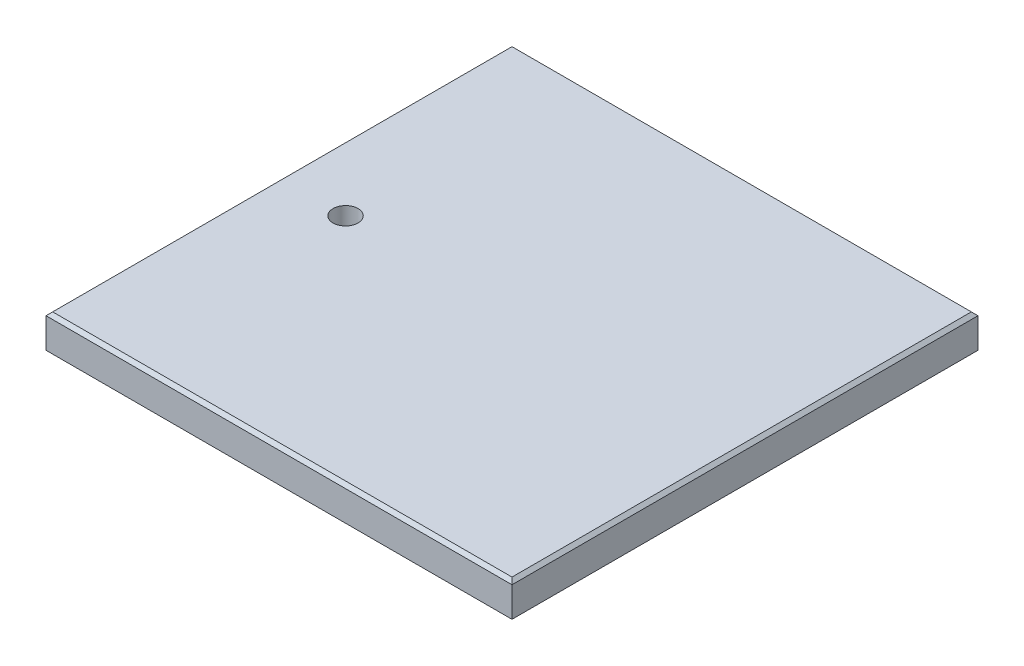
ISO-10303-21;
HEADER;
FILE_DESCRIPTION(('STEP AP214'),'2;1');
FILE_NAME('part.step','',(''),(''),'','','');
FILE_SCHEMA(('AUTOMOTIVE_DESIGN { 1 0 10303 214 1 1 1 1 }'));
ENDSEC;
DATA;
#1=APPLICATION_CONTEXT('core data for automotive mechanical design processes');
#2=APPLICATION_PROTOCOL_DEFINITION('international standard','automotive_design',2000,#1);
#3=PRODUCT_CONTEXT('',#1,'mechanical');
#4=PRODUCT('Part','Part','',(#3));
#5=PRODUCT_RELATED_PRODUCT_CATEGORY('part','',(#4));
#6=PRODUCT_DEFINITION_FORMATION('','',#4);
#7=PRODUCT_DEFINITION_CONTEXT('part definition',#1,'design');
#8=PRODUCT_DEFINITION('design','',#6,#7);
#9=PRODUCT_DEFINITION_SHAPE('','',#8);
#10=(LENGTH_UNIT() NAMED_UNIT(*) SI_UNIT(.MILLI.,.METRE.));
#11=(NAMED_UNIT(*) PLANE_ANGLE_UNIT() SI_UNIT($,.RADIAN.));
#12=(NAMED_UNIT(*) SI_UNIT($,.STERADIAN.) SOLID_ANGLE_UNIT());
#13=UNCERTAINTY_MEASURE_WITH_UNIT(LENGTH_MEASURE(1.E-05),#10,'distance_accuracy_value','');
#14=(GEOMETRIC_REPRESENTATION_CONTEXT(3) GLOBAL_UNCERTAINTY_ASSIGNED_CONTEXT((#13)) GLOBAL_UNIT_ASSIGNED_CONTEXT((#10,
#11,#12)) REPRESENTATION_CONTEXT('',''));
#15=CARTESIAN_POINT('',(0.,0.,0.));
#16=DIRECTION('',(0.,0.,1.));
#17=DIRECTION('',(1.,0.,0.));
#18=AXIS2_PLACEMENT_3D('',#15,#16,#17);
#19=CARTESIAN_POINT('',(44.45,12.7,-44.45));
#20=DIRECTION('',(-1.,0.,0.));
#21=DIRECTION('',(0.,0.,1.));
#22=AXIS2_PLACEMENT_3D('',#19,#20,#21);
#23=PLANE('',#22);
#24=DIRECTION('',(0.,-1.,0.));
#25=VECTOR('',#24,1.);
#26=CARTESIAN_POINT('',(44.45,12.7,-44.45));
#27=LINE('',#26,#25);
#28=CARTESIAN_POINT('',(44.45,12.065,-44.45));
#29=VERTEX_POINT('',#28);
#30=CARTESIAN_POINT('',(44.45,6.35,-44.45));
#31=VERTEX_POINT('',#30);
#32=EDGE_CURVE('E172',#29,#31,#27,.T.);
#33=ORIENTED_EDGE('',*,*,#32,.F.);
#34=DIRECTION('',(0.,0.,1.));
#35=VECTOR('',#34,1.);
#36=CARTESIAN_POINT('',(44.45,12.065,44.45));
#37=LINE('',#36,#35);
#38=CARTESIAN_POINT('',(44.45,12.065,44.45));
#39=VERTEX_POINT('',#38);
#40=EDGE_CURVE('E186',#29,#39,#37,.T.);
#41=ORIENTED_EDGE('',*,*,#40,.T.);
#42=DIRECTION('',(0.,-1.,0.));
#43=VECTOR('',#42,1.);
#44=CARTESIAN_POINT('',(44.45,12.7,44.45));
#45=LINE('',#44,#43);
#46=CARTESIAN_POINT('',(44.45,6.35,44.45));
#47=VERTEX_POINT('',#46);
#48=EDGE_CURVE('E166',#39,#47,#45,.T.);
#49=ORIENTED_EDGE('',*,*,#48,.T.);
#50=DIRECTION('',(0.,0.,-1.));
#51=VECTOR('',#50,1.);
#52=CARTESIAN_POINT('',(44.45,6.35,-44.45));
#53=LINE('',#52,#51);
#54=EDGE_CURVE('E163',#47,#31,#53,.T.);
#55=ORIENTED_EDGE('',*,*,#54,.T.);
#56=EDGE_LOOP('',(#33,#41,#49,#55));
#57=FACE_BOUND('',#56,.T.);
#58=ADVANCED_FACE('F34',(#57),#23,.F.);
#59=CARTESIAN_POINT('',(-44.45,12.7,-44.45));
#60=DIRECTION('',(0.,0.,1.));
#61=DIRECTION('',(1.,0.,0.));
#62=AXIS2_PLACEMENT_3D('',#59,#60,#61);
#63=PLANE('',#62);
#64=DIRECTION('',(0.,-1.,0.));
#65=VECTOR('',#64,1.);
#66=CARTESIAN_POINT('',(-44.45,12.7,-44.45));
#67=LINE('',#66,#65);
#68=CARTESIAN_POINT('',(-44.45,12.065,-44.45));
#69=VERTEX_POINT('',#68);
#70=CARTESIAN_POINT('',(-44.45,6.35,-44.45));
#71=VERTEX_POINT('',#70);
#72=EDGE_CURVE('E170',#69,#71,#67,.T.);
#73=ORIENTED_EDGE('',*,*,#72,.F.);
#74=DIRECTION('',(1.,0.,0.));
#75=VECTOR('',#74,1.);
#76=CARTESIAN_POINT('',(44.45,12.065,-44.45));
#77=LINE('',#76,#75);
#78=EDGE_CURVE('E12',#69,#29,#77,.T.);
#79=ORIENTED_EDGE('',*,*,#78,.T.);
#80=ORIENTED_EDGE('',*,*,#32,.T.);
#81=DIRECTION('',(-1.,0.,0.));
#82=VECTOR('',#81,1.);
#83=CARTESIAN_POINT('',(-44.45,6.35,-44.45));
#84=LINE('',#83,#82);
#85=EDGE_CURVE('E160',#31,#71,#84,.T.);
#86=ORIENTED_EDGE('',*,*,#85,.T.);
#87=EDGE_LOOP('',(#73,#79,#80,#86));
#88=FACE_BOUND('',#87,.T.);
#89=ADVANCED_FACE('F257',(#88),#63,.F.);
#90=CARTESIAN_POINT('',(-44.45,12.7,-44.45));
#91=DIRECTION('',(1.,0.,0.));
#92=DIRECTION('',(0.,0.,-1.));
#93=AXIS2_PLACEMENT_3D('',#90,#91,#92);
#94=PLANE('',#93);
#95=DIRECTION('',(0.,-1.,0.));
#96=VECTOR('',#95,1.);
#97=CARTESIAN_POINT('',(-44.45,12.7,44.45));
#98=LINE('',#97,#96);
#99=CARTESIAN_POINT('',(-44.45,12.065,44.45));
#100=VERTEX_POINT('',#99);
#101=CARTESIAN_POINT('',(-44.45,6.35,44.45));
#102=VERTEX_POINT('',#101);
#103=EDGE_CURVE('E168',#100,#102,#98,.T.);
#104=ORIENTED_EDGE('',*,*,#103,.F.);
#105=DIRECTION('',(0.,0.,-1.));
#106=VECTOR('',#105,1.);
#107=CARTESIAN_POINT('',(-44.45,12.065,-44.45));
#108=LINE('',#107,#106);
#109=EDGE_CURVE('E43',#100,#69,#108,.T.);
#110=ORIENTED_EDGE('',*,*,#109,.T.);
#111=ORIENTED_EDGE('',*,*,#72,.T.);
#112=DIRECTION('',(0.,0.,1.));
#113=VECTOR('',#112,1.);
#114=CARTESIAN_POINT('',(-44.45,6.35,-44.45));
#115=LINE('',#114,#113);
#116=EDGE_CURVE('E133',#71,#102,#115,.T.);
#117=ORIENTED_EDGE('',*,*,#116,.T.);
#118=EDGE_LOOP('',(#104,#110,#111,#117));
#119=FACE_BOUND('',#118,.T.);
#120=ADVANCED_FACE('F264',(#119),#94,.F.);
#121=CARTESIAN_POINT('',(-44.45,12.7,44.45));
#122=DIRECTION('',(0.,0.,-1.));
#123=DIRECTION('',(-1.,0.,0.));
#124=AXIS2_PLACEMENT_3D('',#121,#122,#123);
#125=PLANE('',#124);
#126=ORIENTED_EDGE('',*,*,#48,.F.);
#127=DIRECTION('',(-1.,0.,0.));
#128=VECTOR('',#127,1.);
#129=CARTESIAN_POINT('',(-44.45,12.065,44.45));
#130=LINE('',#129,#128);
#131=EDGE_CURVE('E58',#39,#100,#130,.T.);
#132=ORIENTED_EDGE('',*,*,#131,.T.);
#133=ORIENTED_EDGE('',*,*,#103,.T.);
#134=DIRECTION('',(1.,0.,0.));
#135=VECTOR('',#134,1.);
#136=CARTESIAN_POINT('',(-44.45,6.35,44.45));
#137=LINE('',#136,#135);
#138=EDGE_CURVE('E174',#102,#47,#137,.T.);
#139=ORIENTED_EDGE('',*,*,#138,.T.);
#140=EDGE_LOOP('',(#126,#132,#133,#139));
#141=FACE_BOUND('',#140,.T.);
#142=ADVANCED_FACE('F298',(#141),#125,.F.);
#143=CARTESIAN_POINT('',(0.,12.7,0.));
#144=DIRECTION('',(0.,1.,0.));
#145=DIRECTION('',(0.,0.,1.));
#146=AXIS2_PLACEMENT_3D('',#143,#144,#145);
#147=PLANE('',#146);
#148=DIRECTION('',(1.,0.,0.));
#149=VECTOR('',#148,1.);
#150=CARTESIAN_POINT('',(44.45,12.7,43.815));
#151=LINE('',#150,#149);
#152=CARTESIAN_POINT('',(-43.815,12.7,43.815));
#153=VERTEX_POINT('',#152);
#154=CARTESIAN_POINT('',(43.815,12.7,43.815));
#155=VERTEX_POINT('',#154);
#156=EDGE_CURVE('E181',#153,#155,#151,.T.);
#157=ORIENTED_EDGE('',*,*,#156,.T.);
#158=DIRECTION('',(0.,0.,-1.));
#159=VECTOR('',#158,1.);
#160=CARTESIAN_POINT('',(43.815,12.7,-44.45));
#161=LINE('',#160,#159);
#162=CARTESIAN_POINT('',(43.815,12.7,-43.815));
#163=VERTEX_POINT('',#162);
#164=EDGE_CURVE('E183',#155,#163,#161,.T.);
#165=ORIENTED_EDGE('',*,*,#164,.T.);
#166=DIRECTION('',(-1.,0.,0.));
#167=VECTOR('',#166,1.);
#168=CARTESIAN_POINT('',(-44.45,12.7,-43.815));
#169=LINE('',#168,#167);
#170=CARTESIAN_POINT('',(-43.815,12.7,-43.815));
#171=VERTEX_POINT('',#170);
#172=EDGE_CURVE('E177',#163,#171,#169,.T.);
#173=ORIENTED_EDGE('',*,*,#172,.T.);
#174=DIRECTION('',(0.,0.,1.));
#175=VECTOR('',#174,1.);
#176=CARTESIAN_POINT('',(-43.815,12.7,44.45));
#177=LINE('',#176,#175);
#178=EDGE_CURVE('E179',#171,#153,#177,.T.);
#179=ORIENTED_EDGE('',*,*,#178,.T.);
#180=EDGE_LOOP('',(#157,#165,#173,#179));
#181=FACE_BOUND('',#180,.T.);
#182=CARTESIAN_POINT('',(-31.75,12.7,0.));
#183=DIRECTION('',(0.,1.,0.));
#184=DIRECTION('',(0.,0.,1.));
#185=AXIS2_PLACEMENT_3D('',#182,#183,#184);
#186=CIRCLE('',#185,2.3876);
#187=CARTESIAN_POINT('',(-31.75,12.7,2.3876));
#188=VERTEX_POINT('',#187);
#189=EDGE_CURVE('E202',#188,#188,#186,.T.);
#190=ORIENTED_EDGE('',*,*,#189,.F.);
#191=EDGE_LOOP('',(#190));
#192=FACE_BOUND('',#191,.T.);
#193=ADVANCED_FACE('F295',(#181,#192),#147,.T.);
#194=CARTESIAN_POINT('',(0.,6.35,0.));
#195=DIRECTION('',(0.,1.,0.));
#196=DIRECTION('',(0.,0.,1.));
#197=AXIS2_PLACEMENT_3D('',#194,#195,#196);
#198=PLANE('',#197);
#199=DIRECTION('',(-1.,0.,0.));
#200=VECTOR('',#199,1.);
#201=CARTESIAN_POINT('',(-38.1,6.35,-38.1));
#202=LINE('',#201,#200);
#203=CARTESIAN_POINT('',(38.1,6.35,-38.1));
#204=VERTEX_POINT('',#203);
#205=CARTESIAN_POINT('',(-38.1,6.35,-38.1));
#206=VERTEX_POINT('',#205);
#207=EDGE_CURVE('E117',#204,#206,#202,.T.);
#208=ORIENTED_EDGE('',*,*,#207,.T.);
#209=DIRECTION('',(0.,0.,1.));
#210=VECTOR('',#209,1.);
#211=CARTESIAN_POINT('',(-38.1,6.35,-38.1));
#212=LINE('',#211,#210);
#213=CARTESIAN_POINT('',(-38.1,6.35,38.1));
#214=VERTEX_POINT('',#213);
#215=EDGE_CURVE('E138',#206,#214,#212,.T.);
#216=ORIENTED_EDGE('',*,*,#215,.T.);
#217=DIRECTION('',(1.,0.,0.));
#218=VECTOR('',#217,1.);
#219=CARTESIAN_POINT('',(-38.1,6.35,38.1));
#220=LINE('',#219,#218);
#221=CARTESIAN_POINT('',(38.1,6.35,38.1));
#222=VERTEX_POINT('',#221);
#223=EDGE_CURVE('E120',#214,#222,#220,.T.);
#224=ORIENTED_EDGE('',*,*,#223,.T.);
#225=DIRECTION('',(0.,0.,-1.));
#226=VECTOR('',#225,1.);
#227=CARTESIAN_POINT('',(38.1,6.35,-38.1));
#228=LINE('',#227,#226);
#229=EDGE_CURVE('E111',#222,#204,#228,.T.);
#230=ORIENTED_EDGE('',*,*,#229,.T.);
#231=EDGE_LOOP('',(#208,#216,#224,#230));
#232=FACE_BOUND('',#231,.T.);
#233=ORIENTED_EDGE('',*,*,#138,.F.);
#234=ORIENTED_EDGE('',*,*,#116,.F.);
#235=ORIENTED_EDGE('',*,*,#85,.F.);
#236=ORIENTED_EDGE('',*,*,#54,.F.);
#237=EDGE_LOOP('',(#233,#234,#235,#236));
#238=FACE_BOUND('',#237,.T.);
#239=ADVANCED_FACE('F113',(#232,#238),#198,.F.);
#240=CARTESIAN_POINT('',(38.1,6.35,-38.1));
#241=DIRECTION('',(-1.,0.,0.));
#242=DIRECTION('',(0.,0.,1.));
#243=AXIS2_PLACEMENT_3D('',#240,#241,#242);
#244=PLANE('',#243);
#245=DIRECTION('',(0.,0.,-1.));
#246=VECTOR('',#245,1.);
#247=CARTESIAN_POINT('',(38.1,0.,-38.1));
#248=LINE('',#247,#246);
#249=CARTESIAN_POINT('',(38.1,0.,38.1));
#250=VERTEX_POINT('',#249);
#251=CARTESIAN_POINT('',(38.1,0.,-38.1));
#252=VERTEX_POINT('',#251);
#253=EDGE_CURVE('E129',#250,#252,#248,.T.);
#254=ORIENTED_EDGE('',*,*,#253,.T.);
#255=DIRECTION('',(0.,-1.,0.));
#256=VECTOR('',#255,1.);
#257=CARTESIAN_POINT('',(38.1,6.35,-38.1));
#258=LINE('',#257,#256);
#259=EDGE_CURVE('E126',#204,#252,#258,.T.);
#260=ORIENTED_EDGE('',*,*,#259,.F.);
#261=ORIENTED_EDGE('',*,*,#229,.F.);
#262=DIRECTION('',(0.,-1.,0.));
#263=VECTOR('',#262,1.);
#264=CARTESIAN_POINT('',(38.1,6.35,38.1));
#265=LINE('',#264,#263);
#266=EDGE_CURVE('E144',#222,#250,#265,.T.);
#267=ORIENTED_EDGE('',*,*,#266,.T.);
#268=EDGE_LOOP('',(#254,#260,#261,#267));
#269=FACE_BOUND('',#268,.T.);
#270=ADVANCED_FACE('F127',(#269),#244,.F.);
#271=CARTESIAN_POINT('',(-38.1,6.35,-38.1));
#272=DIRECTION('',(0.,0.,1.));
#273=DIRECTION('',(1.,0.,0.));
#274=AXIS2_PLACEMENT_3D('',#271,#272,#273);
#275=PLANE('',#274);
#276=DIRECTION('',(-1.,0.,0.));
#277=VECTOR('',#276,1.);
#278=CARTESIAN_POINT('',(-38.1,0.,-38.1));
#279=LINE('',#278,#277);
#280=CARTESIAN_POINT('',(-38.1,0.,-38.1));
#281=VERTEX_POINT('',#280);
#282=EDGE_CURVE('E146',#252,#281,#279,.T.);
#283=ORIENTED_EDGE('',*,*,#282,.T.);
#284=DIRECTION('',(0.,-1.,0.));
#285=VECTOR('',#284,1.);
#286=CARTESIAN_POINT('',(-38.1,6.35,-38.1));
#287=LINE('',#286,#285);
#288=EDGE_CURVE('E134',#206,#281,#287,.T.);
#289=ORIENTED_EDGE('',*,*,#288,.F.);
#290=ORIENTED_EDGE('',*,*,#207,.F.);
#291=ORIENTED_EDGE('',*,*,#259,.T.);
#292=EDGE_LOOP('',(#283,#289,#290,#291));
#293=FACE_BOUND('',#292,.T.);
#294=ADVANCED_FACE('F136',(#293),#275,.F.);
#295=CARTESIAN_POINT('',(-38.1,6.35,-38.1));
#296=DIRECTION('',(1.,0.,0.));
#297=DIRECTION('',(0.,0.,-1.));
#298=AXIS2_PLACEMENT_3D('',#295,#296,#297);
#299=PLANE('',#298);
#300=DIRECTION('',(0.,0.,1.));
#301=VECTOR('',#300,1.);
#302=CARTESIAN_POINT('',(-38.1,0.,-38.1));
#303=LINE('',#302,#301);
#304=CARTESIAN_POINT('',(-38.1,0.,38.1));
#305=VERTEX_POINT('',#304);
#306=EDGE_CURVE('E149',#281,#305,#303,.T.);
#307=ORIENTED_EDGE('',*,*,#306,.T.);
#308=DIRECTION('',(0.,-1.,0.));
#309=VECTOR('',#308,1.);
#310=CARTESIAN_POINT('',(-38.1,6.35,38.1));
#311=LINE('',#310,#309);
#312=EDGE_CURVE('E154',#214,#305,#311,.T.);
#313=ORIENTED_EDGE('',*,*,#312,.F.);
#314=ORIENTED_EDGE('',*,*,#215,.F.);
#315=ORIENTED_EDGE('',*,*,#288,.T.);
#316=EDGE_LOOP('',(#307,#313,#314,#315));
#317=FACE_BOUND('',#316,.T.);
#318=ADVANCED_FACE('F246',(#317),#299,.F.);
#319=CARTESIAN_POINT('',(-38.1,6.35,38.1));
#320=DIRECTION('',(0.,0.,-1.));
#321=DIRECTION('',(-1.,0.,0.));
#322=AXIS2_PLACEMENT_3D('',#319,#320,#321);
#323=PLANE('',#322);
#324=DIRECTION('',(1.,0.,0.));
#325=VECTOR('',#324,1.);
#326=CARTESIAN_POINT('',(-38.1,0.,38.1));
#327=LINE('',#326,#325);
#328=EDGE_CURVE('E123',#305,#250,#327,.T.);
#329=ORIENTED_EDGE('',*,*,#328,.T.);
#330=ORIENTED_EDGE('',*,*,#266,.F.);
#331=ORIENTED_EDGE('',*,*,#223,.F.);
#332=ORIENTED_EDGE('',*,*,#312,.T.);
#333=EDGE_LOOP('',(#329,#330,#331,#332));
#334=FACE_BOUND('',#333,.T.);
#335=ADVANCED_FACE('F237',(#334),#323,.F.);
#336=CARTESIAN_POINT('',(0.,0.,0.));
#337=DIRECTION('',(0.,1.,0.));
#338=DIRECTION('',(0.,0.,1.));
#339=AXIS2_PLACEMENT_3D('',#336,#337,#338);
#340=PLANE('',#339);
#341=CARTESIAN_POINT('',(-31.75,0.,-15.875));
#342=DIRECTION('',(0.,-1.,0.));
#343=DIRECTION('',(0.,0.,-1.));
#344=AXIS2_PLACEMENT_3D('',#341,#342,#343);
#345=CIRCLE('',#344,3.175);
#346=CARTESIAN_POINT('',(-31.75,0.,-19.05));
#347=VERTEX_POINT('',#346);
#348=EDGE_CURVE('E218',#347,#347,#345,.T.);
#349=ORIENTED_EDGE('',*,*,#348,.F.);
#350=EDGE_LOOP('',(#349));
#351=FACE_BOUND('',#350,.T.);
#352=CARTESIAN_POINT('',(-31.75,0.,15.875));
#353=DIRECTION('',(0.,-1.,0.));
#354=DIRECTION('',(0.,0.,-1.));
#355=AXIS2_PLACEMENT_3D('',#352,#353,#354);
#356=CIRCLE('',#355,3.175);
#357=CARTESIAN_POINT('',(-31.75,0.,12.7));
#358=VERTEX_POINT('',#357);
#359=EDGE_CURVE('E212',#358,#358,#356,.T.);
#360=ORIENTED_EDGE('',*,*,#359,.F.);
#361=EDGE_LOOP('',(#360));
#362=FACE_BOUND('',#361,.T.);
#363=CARTESIAN_POINT('',(-31.75,0.,0.));
#364=DIRECTION('',(0.,1.,0.));
#365=DIRECTION('',(0.,0.,1.));
#366=AXIS2_PLACEMENT_3D('',#363,#364,#365);
#367=CIRCLE('',#366,2.3876);
#368=CARTESIAN_POINT('',(-31.75,0.,2.3876));
#369=VERTEX_POINT('',#368);
#370=EDGE_CURVE('E147',#369,#369,#367,.T.);
#371=ORIENTED_EDGE('',*,*,#370,.T.);
#372=EDGE_LOOP('',(#371));
#373=FACE_BOUND('',#372,.T.);
#374=ORIENTED_EDGE('',*,*,#282,.F.);
#375=ORIENTED_EDGE('',*,*,#253,.F.);
#376=ORIENTED_EDGE('',*,*,#328,.F.);
#377=ORIENTED_EDGE('',*,*,#306,.F.);
#378=EDGE_LOOP('',(#374,#375,#376,#377));
#379=FACE_BOUND('',#378,.T.);
#380=ADVANCED_FACE('F233',(#351,#362,#373,#379),#340,.F.);
#381=CARTESIAN_POINT('',(-31.75,0.,0.));
#382=DIRECTION('',(0.,1.,0.));
#383=DIRECTION('',(0.,0.,1.));
#384=AXIS2_PLACEMENT_3D('',#381,#382,#383);
#385=CYLINDRICAL_SURFACE('',#384,2.3876);
#386=ORIENTED_EDGE('',*,*,#370,.F.);
#387=EDGE_LOOP('',(#386));
#388=FACE_BOUND('',#387,.T.);
#389=ORIENTED_EDGE('',*,*,#189,.T.);
#390=EDGE_LOOP('',(#389));
#391=FACE_BOUND('',#390,.T.);
#392=ADVANCED_FACE('F236',(#388,#391),#385,.F.);
#393=CARTESIAN_POINT('',(-43.815,12.7,0.));
#394=DIRECTION('',(-0.707106781186548,0.707106781186548,0.));
#395=DIRECTION('',(0.,0.,-1.));
#396=AXIS2_PLACEMENT_3D('',#393,#394,#395);
#397=PLANE('',#396);
#398=DIRECTION('',(0.577350269189626,0.577350269189626,0.577350269189626));
#399=VECTOR('',#398,1.);
#400=CARTESIAN_POINT('',(-29.21,27.305,-29.21));
#401=LINE('',#400,#399);
#402=EDGE_CURVE('E195',#69,#171,#401,.T.);
#403=ORIENTED_EDGE('',*,*,#402,.F.);
#404=ORIENTED_EDGE('',*,*,#109,.F.);
#405=DIRECTION('',(0.577350269189626,0.577350269189626,-0.577350269189626));
#406=VECTOR('',#405,1.);
#407=CARTESIAN_POINT('',(-29.21,27.305,29.21));
#408=LINE('',#407,#406);
#409=EDGE_CURVE('E38',#153,#100,#408,.F.);
#410=ORIENTED_EDGE('',*,*,#409,.F.);
#411=ORIENTED_EDGE('',*,*,#178,.F.);
#412=EDGE_LOOP('',(#403,#404,#410,#411));
#413=FACE_BOUND('',#412,.T.);
#414=ADVANCED_FACE('F36',(#413),#397,.T.);
#415=CARTESIAN_POINT('',(0.,12.7,43.815));
#416=DIRECTION('',(0.,0.707106781186548,0.707106781186548));
#417=DIRECTION('',(-1.,0.,0.));
#418=AXIS2_PLACEMENT_3D('',#415,#416,#417);
#419=PLANE('',#418);
#420=ORIENTED_EDGE('',*,*,#409,.T.);
#421=ORIENTED_EDGE('',*,*,#131,.F.);
#422=DIRECTION('',(-0.577350269189626,0.577350269189626,-0.577350269189626));
#423=VECTOR('',#422,1.);
#424=CARTESIAN_POINT('',(29.21,27.305,29.21));
#425=LINE('',#424,#423);
#426=EDGE_CURVE('E193',#155,#39,#425,.F.);
#427=ORIENTED_EDGE('',*,*,#426,.F.);
#428=ORIENTED_EDGE('',*,*,#156,.F.);
#429=EDGE_LOOP('',(#420,#421,#427,#428));
#430=FACE_BOUND('',#429,.T.);
#431=ADVANCED_FACE('F277',(#430),#419,.T.);
#432=CARTESIAN_POINT('',(0.,12.7,-43.815));
#433=DIRECTION('',(0.,0.707106781186548,-0.707106781186548));
#434=DIRECTION('',(1.,0.,0.));
#435=AXIS2_PLACEMENT_3D('',#432,#433,#434);
#436=PLANE('',#435);
#437=ORIENTED_EDGE('',*,*,#402,.T.);
#438=ORIENTED_EDGE('',*,*,#172,.F.);
#439=DIRECTION('',(0.577350269189626,-0.577350269189626,-0.577350269189626));
#440=VECTOR('',#439,1.);
#441=CARTESIAN_POINT('',(29.21,27.305,-29.21));
#442=LINE('',#441,#440);
#443=EDGE_CURVE('E191',#29,#163,#442,.F.);
#444=ORIENTED_EDGE('',*,*,#443,.F.);
#445=ORIENTED_EDGE('',*,*,#78,.F.);
#446=EDGE_LOOP('',(#437,#438,#444,#445));
#447=FACE_BOUND('',#446,.T.);
#448=ADVANCED_FACE('F274',(#447),#436,.T.);
#449=CARTESIAN_POINT('',(43.815,12.7,0.));
#450=DIRECTION('',(0.707106781186548,0.707106781186548,0.));
#451=DIRECTION('',(0.,0.,1.));
#452=AXIS2_PLACEMENT_3D('',#449,#450,#451);
#453=PLANE('',#452);
#454=ORIENTED_EDGE('',*,*,#426,.T.);
#455=ORIENTED_EDGE('',*,*,#40,.F.);
#456=ORIENTED_EDGE('',*,*,#443,.T.);
#457=ORIENTED_EDGE('',*,*,#164,.F.);
#458=EDGE_LOOP('',(#454,#455,#456,#457));
#459=FACE_BOUND('',#458,.T.);
#460=ADVANCED_FACE('F270',(#459),#453,.T.);
#461=CARTESIAN_POINT('',(-31.75,7.62,15.875));
#462=DIRECTION('',(0.,-1.,0.));
#463=DIRECTION('',(0.,0.,-1.));
#464=AXIS2_PLACEMENT_3D('',#461,#462,#463);
#465=CYLINDRICAL_SURFACE('',#464,3.175);
#466=CARTESIAN_POINT('',(-31.75,7.62,15.875));
#467=DIRECTION('',(0.,-1.,0.));
#468=DIRECTION('',(0.,0.,-1.));
#469=AXIS2_PLACEMENT_3D('',#466,#467,#468);
#470=CIRCLE('',#469,3.175);
#471=CARTESIAN_POINT('',(-31.75,7.62,12.7));
#472=VERTEX_POINT('',#471);
#473=EDGE_CURVE('E194',#472,#472,#470,.T.);
#474=CARTESIAN_POINT('',(-31.75,7.62,12.7));
#475=CARTESIAN_POINT('',(-31.75,7.540625,12.7));
#476=CARTESIAN_POINT('',(-31.75,7.46125,12.7));
#477=CARTESIAN_POINT('',(-31.75,7.3025,12.7));
#478=CARTESIAN_POINT('',(-31.75,7.223125,12.7));
#479=CARTESIAN_POINT('',(-31.75,7.064375,12.7));
#480=CARTESIAN_POINT('',(-31.75,6.985,12.7));
#481=CARTESIAN_POINT('',(-31.75,6.82625,12.7));
#482=CARTESIAN_POINT('',(-31.75,6.746875,12.7));
#483=CARTESIAN_POINT('',(-31.75,6.588125,12.7));
#484=CARTESIAN_POINT('',(-31.75,6.50875,12.7));
#485=CARTESIAN_POINT('',(-31.75,6.35,12.7));
#486=CARTESIAN_POINT('',(-31.75,6.270625,12.7));
#487=CARTESIAN_POINT('',(-31.75,6.111875,12.7));
#488=CARTESIAN_POINT('',(-31.75,6.0325,12.7));
#489=CARTESIAN_POINT('',(-31.75,5.87375,12.7));
#490=CARTESIAN_POINT('',(-31.75,5.794375,12.7));
#491=CARTESIAN_POINT('',(-31.75,5.635625,12.7));
#492=CARTESIAN_POINT('',(-31.75,5.55625,12.7));
#493=CARTESIAN_POINT('',(-31.75,5.3975,12.7));
#494=CARTESIAN_POINT('',(-31.75,5.318125,12.7));
#495=CARTESIAN_POINT('',(-31.75,5.159375,12.7));
#496=CARTESIAN_POINT('',(-31.75,5.08,12.7));
#497=CARTESIAN_POINT('',(-31.75,4.92125,12.7));
#498=CARTESIAN_POINT('',(-31.75,4.841875,12.7));
#499=CARTESIAN_POINT('',(-31.75,4.683125,12.7));
#500=CARTESIAN_POINT('',(-31.75,4.60375,12.7));
#501=CARTESIAN_POINT('',(-31.75,4.445,12.7));
#502=CARTESIAN_POINT('',(-31.75,4.365625,12.7));
#503=CARTESIAN_POINT('',(-31.75,4.206875,12.7));
#504=CARTESIAN_POINT('',(-31.75,4.1275,12.7));
#505=CARTESIAN_POINT('',(-31.75,3.96875,12.7));
#506=CARTESIAN_POINT('',(-31.75,3.889375,12.7));
#507=CARTESIAN_POINT('',(-31.75,3.730625,12.7));
#508=CARTESIAN_POINT('',(-31.75,3.65125,12.7));
#509=CARTESIAN_POINT('',(-31.75,3.4925,12.7));
#510=CARTESIAN_POINT('',(-31.75,3.413125,12.7));
#511=CARTESIAN_POINT('',(-31.75,3.254375,12.7));
#512=CARTESIAN_POINT('',(-31.75,3.175,12.7));
#513=CARTESIAN_POINT('',(-31.75,3.01625,12.7));
#514=CARTESIAN_POINT('',(-31.75,2.936875,12.7));
#515=CARTESIAN_POINT('',(-31.75,2.778125,12.7));
#516=CARTESIAN_POINT('',(-31.75,2.69875,12.7));
#517=CARTESIAN_POINT('',(-31.75,2.54,12.7));
#518=CARTESIAN_POINT('',(-31.75,2.460625,12.7));
#519=CARTESIAN_POINT('',(-31.75,2.301875,12.7));
#520=CARTESIAN_POINT('',(-31.75,2.2225,12.7));
#521=CARTESIAN_POINT('',(-31.75,2.06375,12.7));
#522=CARTESIAN_POINT('',(-31.75,1.984375,12.7));
#523=CARTESIAN_POINT('',(-31.75,1.825625,12.7));
#524=CARTESIAN_POINT('',(-31.75,1.74625,12.7));
#525=CARTESIAN_POINT('',(-31.75,1.5875,12.7));
#526=CARTESIAN_POINT('',(-31.75,1.508125,12.7));
#527=CARTESIAN_POINT('',(-31.75,1.349375,12.7));
#528=CARTESIAN_POINT('',(-31.75,1.27,12.7));
#529=CARTESIAN_POINT('',(-31.75,1.11125,12.7));
#530=CARTESIAN_POINT('',(-31.75,1.031875,12.7));
#531=CARTESIAN_POINT('',(-31.75,0.873125,12.7));
#532=CARTESIAN_POINT('',(-31.75,0.79375,12.7));
#533=CARTESIAN_POINT('',(-31.75,0.635,12.7));
#534=CARTESIAN_POINT('',(-31.75,0.555625,12.7));
#535=CARTESIAN_POINT('',(-31.75,0.396875,12.7));
#536=CARTESIAN_POINT('',(-31.75,0.3175,12.7));
#537=CARTESIAN_POINT('',(-31.75,0.15875,12.7));
#538=CARTESIAN_POINT('',(-31.75,0.0793749999999999,12.7));
#539=CARTESIAN_POINT('',(-31.75,0.,12.7));
#540=B_SPLINE_CURVE_WITH_KNOTS('',3,(#474,#475,#476,#477,#478,#479,#480,#481,#482,#483,#484,
#485,#486,#487,#488,#489,#490,#491,#492,#493,#494,#495,#496,#497,#498,#499,#500,#501,#502,#503,
#504,#505,#506,#507,#508,#509,#510,#511,#512,#513,#514,#515,#516,#517,#518,#519,#520,#521,#522,
#523,#524,#525,#526,#527,#528,#529,#530,#531,#532,#533,#534,#535,#536,#537,#538,#539),
.UNSPECIFIED.,.F.,.F.,(4,2,2,2,2,2,2,2,2,2,2,2,2,2,2,2,2,2,2,2,2,2,2,2,2,2,2,2,2,2,2,2,4),(0.,
0.238125,0.476249999999999,0.714375,0.952499999999999,1.190625,1.42875,1.666875,1.905,2.143125,
2.38125,2.619375,2.8575,3.095625,3.33375,3.571875,3.81,4.048125,4.28625,4.524375,4.7625,
5.000625,5.23875,5.476875,5.715,5.953125,6.19125,6.429375,6.6675,6.905625,7.14375,7.381875,
7.62),.UNSPECIFIED.);
#541=EDGE_CURVE('BSEAM273',#472,#358,#540,.T.);
#542=ORIENTED_EDGE('',*,*,#473,.F.);
#543=ORIENTED_EDGE('',*,*,#359,.T.);
#544=ORIENTED_EDGE('',*,*,#541,.T.);
#545=ORIENTED_EDGE('',*,*,#541,.F.);
#546=EDGE_LOOP('',(#542,#544,#543,#545));
#547=FACE_BOUND('',#546,.T.);
#548=ADVANCED_FACE('F273',(#547),#465,.F.);
#549=CARTESIAN_POINT('',(-31.75,7.62,15.875));
#550=DIRECTION('',(0.,-1.,0.));
#551=DIRECTION('',(0.,0.,-1.));
#552=AXIS2_PLACEMENT_3D('',#549,#550,#551);
#553=PLANE('',#552);
#554=ORIENTED_EDGE('',*,*,#473,.T.);
#555=EDGE_LOOP('',(#554));
#556=FACE_BOUND('',#555,.T.);
#557=ADVANCED_FACE('F229',(#556),#553,.T.);
#558=CARTESIAN_POINT('',(-31.75,7.62,-15.875));
#559=DIRECTION('',(0.,-1.,0.));
#560=DIRECTION('',(0.,0.,-1.));
#561=AXIS2_PLACEMENT_3D('',#558,#559,#560);
#562=CYLINDRICAL_SURFACE('',#561,3.175);
#563=CARTESIAN_POINT('',(-31.75,7.62,-15.875));
#564=DIRECTION('',(0.,-1.,0.));
#565=DIRECTION('',(0.,0.,-1.));
#566=AXIS2_PLACEMENT_3D('',#563,#564,#565);
#567=CIRCLE('',#566,3.175);
#568=CARTESIAN_POINT('',(-31.75,7.62,-19.05));
#569=VERTEX_POINT('',#568);
#570=EDGE_CURVE('E215',#569,#569,#567,.T.);
#571=CARTESIAN_POINT('',(-31.75,7.62,-19.05));
#572=CARTESIAN_POINT('',(-31.75,7.540625,-19.05));
#573=CARTESIAN_POINT('',(-31.75,7.46125,-19.05));
#574=CARTESIAN_POINT('',(-31.75,7.3025,-19.05));
#575=CARTESIAN_POINT('',(-31.75,7.223125,-19.05));
#576=CARTESIAN_POINT('',(-31.75,7.064375,-19.05));
#577=CARTESIAN_POINT('',(-31.75,6.985,-19.05));
#578=CARTESIAN_POINT('',(-31.75,6.82625,-19.05));
#579=CARTESIAN_POINT('',(-31.75,6.746875,-19.05));
#580=CARTESIAN_POINT('',(-31.75,6.588125,-19.05));
#581=CARTESIAN_POINT('',(-31.75,6.50875,-19.05));
#582=CARTESIAN_POINT('',(-31.75,6.35,-19.05));
#583=CARTESIAN_POINT('',(-31.75,6.270625,-19.05));
#584=CARTESIAN_POINT('',(-31.75,6.111875,-19.05));
#585=CARTESIAN_POINT('',(-31.75,6.0325,-19.05));
#586=CARTESIAN_POINT('',(-31.75,5.87375,-19.05));
#587=CARTESIAN_POINT('',(-31.75,5.794375,-19.05));
#588=CARTESIAN_POINT('',(-31.75,5.635625,-19.05));
#589=CARTESIAN_POINT('',(-31.75,5.55625,-19.05));
#590=CARTESIAN_POINT('',(-31.75,5.3975,-19.05));
#591=CARTESIAN_POINT('',(-31.75,5.318125,-19.05));
#592=CARTESIAN_POINT('',(-31.75,5.159375,-19.05));
#593=CARTESIAN_POINT('',(-31.75,5.08,-19.05));
#594=CARTESIAN_POINT('',(-31.75,4.92125,-19.05));
#595=CARTESIAN_POINT('',(-31.75,4.841875,-19.05));
#596=CARTESIAN_POINT('',(-31.75,4.683125,-19.05));
#597=CARTESIAN_POINT('',(-31.75,4.60375,-19.05));
#598=CARTESIAN_POINT('',(-31.75,4.445,-19.05));
#599=CARTESIAN_POINT('',(-31.75,4.365625,-19.05));
#600=CARTESIAN_POINT('',(-31.75,4.206875,-19.05));
#601=CARTESIAN_POINT('',(-31.75,4.1275,-19.05));
#602=CARTESIAN_POINT('',(-31.75,3.96875,-19.05));
#603=CARTESIAN_POINT('',(-31.75,3.889375,-19.05));
#604=CARTESIAN_POINT('',(-31.75,3.730625,-19.05));
#605=CARTESIAN_POINT('',(-31.75,3.65125,-19.05));
#606=CARTESIAN_POINT('',(-31.75,3.4925,-19.05));
#607=CARTESIAN_POINT('',(-31.75,3.413125,-19.05));
#608=CARTESIAN_POINT('',(-31.75,3.254375,-19.05));
#609=CARTESIAN_POINT('',(-31.75,3.175,-19.05));
#610=CARTESIAN_POINT('',(-31.75,3.01625,-19.05));
#611=CARTESIAN_POINT('',(-31.75,2.936875,-19.05));
#612=CARTESIAN_POINT('',(-31.75,2.778125,-19.05));
#613=CARTESIAN_POINT('',(-31.75,2.69875,-19.05));
#614=CARTESIAN_POINT('',(-31.75,2.54,-19.05));
#615=CARTESIAN_POINT('',(-31.75,2.460625,-19.05));
#616=CARTESIAN_POINT('',(-31.75,2.301875,-19.05));
#617=CARTESIAN_POINT('',(-31.75,2.2225,-19.05));
#618=CARTESIAN_POINT('',(-31.75,2.06375,-19.05));
#619=CARTESIAN_POINT('',(-31.75,1.984375,-19.05));
#620=CARTESIAN_POINT('',(-31.75,1.825625,-19.05));
#621=CARTESIAN_POINT('',(-31.75,1.74625,-19.05));
#622=CARTESIAN_POINT('',(-31.75,1.5875,-19.05));
#623=CARTESIAN_POINT('',(-31.75,1.508125,-19.05));
#624=CARTESIAN_POINT('',(-31.75,1.349375,-19.05));
#625=CARTESIAN_POINT('',(-31.75,1.27,-19.05));
#626=CARTESIAN_POINT('',(-31.75,1.11125,-19.05));
#627=CARTESIAN_POINT('',(-31.75,1.031875,-19.05));
#628=CARTESIAN_POINT('',(-31.75,0.873125,-19.05));
#629=CARTESIAN_POINT('',(-31.75,0.79375,-19.05));
#630=CARTESIAN_POINT('',(-31.75,0.635,-19.05));
#631=CARTESIAN_POINT('',(-31.75,0.555625,-19.05));
#632=CARTESIAN_POINT('',(-31.75,0.396875,-19.05));
#633=CARTESIAN_POINT('',(-31.75,0.3175,-19.05));
#634=CARTESIAN_POINT('',(-31.75,0.15875,-19.05));
#635=CARTESIAN_POINT('',(-31.75,0.0793749999999999,-19.05));
#636=CARTESIAN_POINT('',(-31.75,0.,-19.05));
#637=B_SPLINE_CURVE_WITH_KNOTS('',3,(#571,#572,#573,#574,#575,#576,#577,#578,#579,#580,#581,
#582,#583,#584,#585,#586,#587,#588,#589,#590,#591,#592,#593,#594,#595,#596,#597,#598,#599,#600,
#601,#602,#603,#604,#605,#606,#607,#608,#609,#610,#611,#612,#613,#614,#615,#616,#617,#618,#619,
#620,#621,#622,#623,#624,#625,#626,#627,#628,#629,#630,#631,#632,#633,#634,#635,#636),
.UNSPECIFIED.,.F.,.F.,(4,2,2,2,2,2,2,2,2,2,2,2,2,2,2,2,2,2,2,2,2,2,2,2,2,2,2,2,2,2,2,2,4),(0.,
0.238125,0.476249999999999,0.714375,0.952499999999999,1.190625,1.42875,1.666875,1.905,2.143125,
2.38125,2.619375,2.8575,3.095625,3.33375,3.571875,3.81,4.048125,4.28625,4.524375,4.7625,
5.000625,5.23875,5.476875,5.715,5.953125,6.19125,6.429375,6.6675,6.905625,7.14375,7.381875,
7.62),.UNSPECIFIED.);
#638=EDGE_CURVE('BSEAM226',#569,#347,#637,.T.);
#639=ORIENTED_EDGE('',*,*,#570,.F.);
#640=ORIENTED_EDGE('',*,*,#348,.T.);
#641=ORIENTED_EDGE('',*,*,#638,.T.);
#642=ORIENTED_EDGE('',*,*,#638,.F.);
#643=EDGE_LOOP('',(#639,#641,#640,#642));
#644=FACE_BOUND('',#643,.T.);
#645=ADVANCED_FACE('F226',(#644),#562,.F.);
#646=CARTESIAN_POINT('',(-31.75,7.62,-15.875));
#647=DIRECTION('',(0.,-1.,0.));
#648=DIRECTION('',(0.,0.,-1.));
#649=AXIS2_PLACEMENT_3D('',#646,#647,#648);
#650=PLANE('',#649);
#651=ORIENTED_EDGE('',*,*,#570,.T.);
#652=EDGE_LOOP('',(#651));
#653=FACE_BOUND('',#652,.T.);
#654=ADVANCED_FACE('F224',(#653),#650,.T.);
#655=CLOSED_SHELL('',(#58,#89,#120,#142,#193,#239,#270,#294,#318,#335,#380,#392,#414,#431,#448,
#460,#548,#557,#645,#654));
#656=MANIFOLD_SOLID_BREP('B2',#655);
#657=ADVANCED_BREP_SHAPE_REPRESENTATION('',(#18,#656),#14);
#658=SHAPE_DEFINITION_REPRESENTATION(#9,#657);
ENDSEC;
END-ISO-10303-21;
